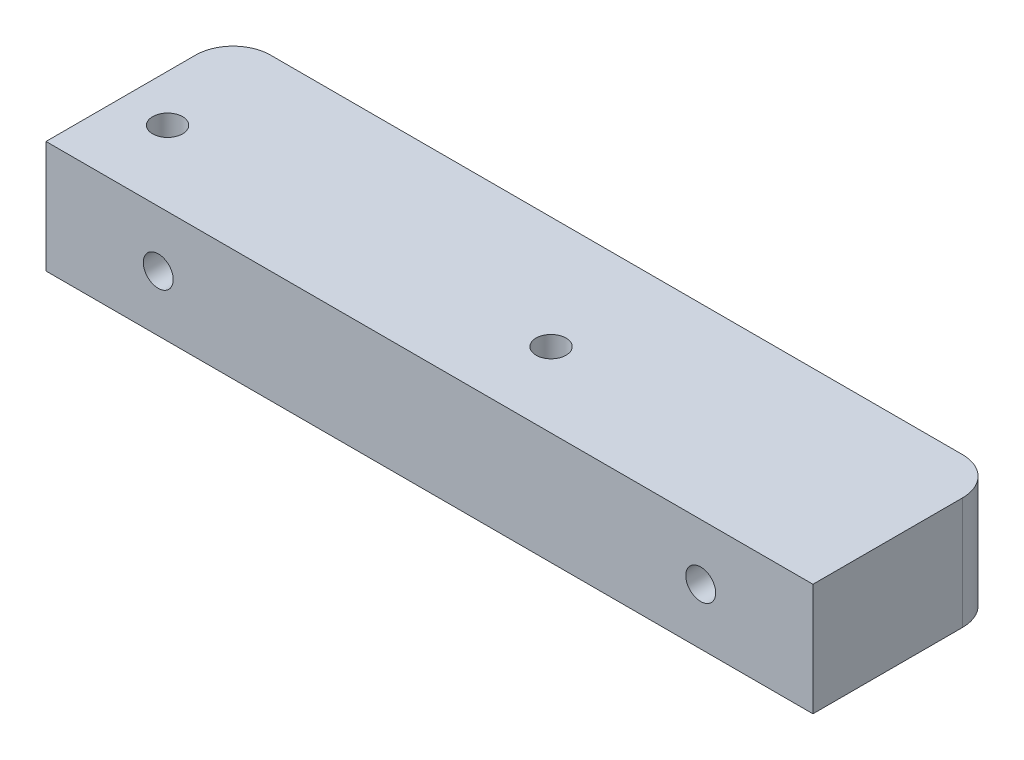
ISO-10303-21;
HEADER;
FILE_DESCRIPTION(('STEP AP214'),'2;1');
FILE_NAME('part.step','',(''),(''),'','','');
FILE_SCHEMA(('AUTOMOTIVE_DESIGN { 1 0 10303 214 1 1 1 1 }'));
ENDSEC;
DATA;
#1=APPLICATION_CONTEXT('core data for automotive mechanical design processes');
#2=APPLICATION_PROTOCOL_DEFINITION('international standard','automotive_design',2000,#1);
#3=PRODUCT_CONTEXT('',#1,'mechanical');
#4=PRODUCT('Part','Part','',(#3));
#5=PRODUCT_RELATED_PRODUCT_CATEGORY('part','',(#4));
#6=PRODUCT_DEFINITION_FORMATION('','',#4);
#7=PRODUCT_DEFINITION_CONTEXT('part definition',#1,'design');
#8=PRODUCT_DEFINITION('design','',#6,#7);
#9=PRODUCT_DEFINITION_SHAPE('','',#8);
#10=(LENGTH_UNIT() NAMED_UNIT(*) SI_UNIT(.MILLI.,.METRE.));
#11=(NAMED_UNIT(*) PLANE_ANGLE_UNIT() SI_UNIT($,.RADIAN.));
#12=(NAMED_UNIT(*) SI_UNIT($,.STERADIAN.) SOLID_ANGLE_UNIT());
#13=UNCERTAINTY_MEASURE_WITH_UNIT(LENGTH_MEASURE(1.E-05),#10,'distance_accuracy_value','');
#14=(GEOMETRIC_REPRESENTATION_CONTEXT(3) GLOBAL_UNCERTAINTY_ASSIGNED_CONTEXT((#13)) GLOBAL_UNIT_ASSIGNED_CONTEXT((#10,
#11,#12)) REPRESENTATION_CONTEXT('',''));
#15=CARTESIAN_POINT('',(0.,0.,0.));
#16=DIRECTION('',(0.,0.,1.));
#17=DIRECTION('',(1.,0.,0.));
#18=AXIS2_PLACEMENT_3D('',#15,#16,#17);
#19=CARTESIAN_POINT('',(0.,6.,0.));
#20=DIRECTION('',(-1.,0.,0.));
#21=DIRECTION('',(0.,0.,1.));
#22=AXIS2_PLACEMENT_3D('',#19,#20,#21);
#23=PLANE('',#22);
#24=DIRECTION('',(0.,0.,-1.));
#25=VECTOR('',#24,1.);
#26=CARTESIAN_POINT('',(0.,0.,0.));
#27=LINE('',#26,#25);
#28=CARTESIAN_POINT('',(0.,0.,0.));
#29=VERTEX_POINT('',#28);
#30=CARTESIAN_POINT('',(0.,0.,-8.00000000000001));
#31=VERTEX_POINT('',#30);
#32=EDGE_CURVE('E117',#29,#31,#27,.T.);
#33=ORIENTED_EDGE('',*,*,#32,.T.);
#34=DIRECTION('',(0.,-1.,0.));
#35=VECTOR('',#34,1.);
#36=CARTESIAN_POINT('',(0.,6.,-8.00000000000001));
#37=LINE('',#36,#35);
#38=CARTESIAN_POINT('',(0.,6.,-8.00000000000001));
#39=VERTEX_POINT('',#38);
#40=EDGE_CURVE('E11',#31,#39,#37,.F.);
#41=ORIENTED_EDGE('',*,*,#40,.T.);
#42=DIRECTION('',(0.,0.,-1.));
#43=VECTOR('',#42,1.);
#44=CARTESIAN_POINT('',(0.,6.,0.));
#45=LINE('',#44,#43);
#46=CARTESIAN_POINT('',(0.,6.,0.));
#47=VERTEX_POINT('',#46);
#48=EDGE_CURVE('E124',#47,#39,#45,.T.);
#49=ORIENTED_EDGE('',*,*,#48,.F.);
#50=DIRECTION('',(0.,-1.,0.));
#51=VECTOR('',#50,1.);
#52=CARTESIAN_POINT('',(0.,6.,0.));
#53=LINE('',#52,#51);
#54=EDGE_CURVE('E109',#47,#29,#53,.T.);
#55=ORIENTED_EDGE('',*,*,#54,.T.);
#56=EDGE_LOOP('',(#33,#41,#49,#55));
#57=FACE_BOUND('',#56,.T.);
#58=ADVANCED_FACE('F35',(#57),#23,.F.);
#59=CARTESIAN_POINT('',(0.,6.,-10.));
#60=DIRECTION('',(0.,0.,1.));
#61=DIRECTION('',(1.,0.,0.));
#62=AXIS2_PLACEMENT_3D('',#59,#60,#61);
#63=PLANE('',#62);
#64=DIRECTION('',(-1.,0.,0.));
#65=VECTOR('',#64,1.);
#66=CARTESIAN_POINT('',(0.,0.,-10.));
#67=LINE('',#66,#65);
#68=CARTESIAN_POINT('',(-2.,0.,-10.));
#69=VERTEX_POINT('',#68);
#70=CARTESIAN_POINT('',(-39.,0.,-10.));
#71=VERTEX_POINT('',#70);
#72=EDGE_CURVE('E119',#69,#71,#67,.T.);
#73=ORIENTED_EDGE('',*,*,#72,.T.);
#74=DIRECTION('',(0.,-1.,0.));
#75=VECTOR('',#74,1.);
#76=CARTESIAN_POINT('',(-39.,6.,-10.));
#77=LINE('',#76,#75);
#78=CARTESIAN_POINT('',(-39.,6.,-10.));
#79=VERTEX_POINT('',#78);
#80=EDGE_CURVE('E56',#71,#79,#77,.F.);
#81=ORIENTED_EDGE('',*,*,#80,.T.);
#82=DIRECTION('',(-1.,0.,0.));
#83=VECTOR('',#82,1.);
#84=CARTESIAN_POINT('',(0.,6.,-10.));
#85=LINE('',#84,#83);
#86=CARTESIAN_POINT('',(-2.,6.,-10.));
#87=VERTEX_POINT('',#86);
#88=EDGE_CURVE('E99',#87,#79,#85,.T.);
#89=ORIENTED_EDGE('',*,*,#88,.F.);
#90=DIRECTION('',(0.,-1.,0.));
#91=VECTOR('',#90,1.);
#92=CARTESIAN_POINT('',(-2.,6.,-10.));
#93=LINE('',#92,#91);
#94=EDGE_CURVE('E131',#87,#69,#93,.T.);
#95=ORIENTED_EDGE('',*,*,#94,.T.);
#96=EDGE_LOOP('',(#73,#81,#89,#95));
#97=FACE_BOUND('',#96,.T.);
#98=ADVANCED_FACE('F139',(#97),#63,.F.);
#99=CARTESIAN_POINT('',(-41.,6.,0.));
#100=DIRECTION('',(1.,0.,0.));
#101=DIRECTION('',(0.,0.,-1.));
#102=AXIS2_PLACEMENT_3D('',#99,#100,#101);
#103=PLANE('',#102);
#104=DIRECTION('',(0.,0.,1.));
#105=VECTOR('',#104,1.);
#106=CARTESIAN_POINT('',(-41.,6.,0.));
#107=LINE('',#106,#105);
#108=CARTESIAN_POINT('',(-41.,6.,-8.));
#109=VERTEX_POINT('',#108);
#110=CARTESIAN_POINT('',(-41.,6.,0.));
#111=VERTEX_POINT('',#110);
#112=EDGE_CURVE('E89',#109,#111,#107,.T.);
#113=ORIENTED_EDGE('',*,*,#112,.F.);
#114=DIRECTION('',(0.,-1.,0.));
#115=VECTOR('',#114,1.);
#116=CARTESIAN_POINT('',(-41.,6.,-8.));
#117=LINE('',#116,#115);
#118=CARTESIAN_POINT('',(-41.,0.,-8.));
#119=VERTEX_POINT('',#118);
#120=EDGE_CURVE('E108',#109,#119,#117,.T.);
#121=ORIENTED_EDGE('',*,*,#120,.T.);
#122=DIRECTION('',(0.,0.,1.));
#123=VECTOR('',#122,1.);
#124=CARTESIAN_POINT('',(-41.,0.,0.));
#125=LINE('',#124,#123);
#126=CARTESIAN_POINT('',(-41.,0.,0.));
#127=VERTEX_POINT('',#126);
#128=EDGE_CURVE('E105',#119,#127,#125,.T.);
#129=ORIENTED_EDGE('',*,*,#128,.T.);
#130=DIRECTION('',(0.,-1.,0.));
#131=VECTOR('',#130,1.);
#132=CARTESIAN_POINT('',(-41.,6.,0.));
#133=LINE('',#132,#131);
#134=EDGE_CURVE('E102',#111,#127,#133,.T.);
#135=ORIENTED_EDGE('',*,*,#134,.F.);
#136=EDGE_LOOP('',(#113,#121,#129,#135));
#137=FACE_BOUND('',#136,.T.);
#138=ADVANCED_FACE('F103',(#137),#103,.F.);
#139=CARTESIAN_POINT('',(0.,6.,0.));
#140=DIRECTION('',(0.,0.,-1.));
#141=DIRECTION('',(-1.,0.,0.));
#142=AXIS2_PLACEMENT_3D('',#139,#140,#141);
#143=PLANE('',#142);
#144=CARTESIAN_POINT('',(-6.,3.,0.));
#145=DIRECTION('',(0.,0.,1.));
#146=DIRECTION('',(1.,0.,0.));
#147=AXIS2_PLACEMENT_3D('',#144,#145,#146);
#148=CIRCLE('',#147,0.800000000000001);
#149=CARTESIAN_POINT('',(-5.2,3.,0.));
#150=VERTEX_POINT('',#149);
#151=EDGE_CURVE('E153',#150,#150,#148,.T.);
#152=ORIENTED_EDGE('',*,*,#151,.F.);
#153=EDGE_LOOP('',(#152));
#154=FACE_BOUND('',#153,.T.);
#155=CARTESIAN_POINT('',(-35.,3.,0.));
#156=DIRECTION('',(0.,0.,1.));
#157=DIRECTION('',(1.,0.,0.));
#158=AXIS2_PLACEMENT_3D('',#155,#156,#157);
#159=CIRCLE('',#158,0.800000000000003);
#160=CARTESIAN_POINT('',(-34.2,3.,0.));
#161=VERTEX_POINT('',#160);
#162=EDGE_CURVE('E146',#161,#161,#159,.T.);
#163=ORIENTED_EDGE('',*,*,#162,.F.);
#164=EDGE_LOOP('',(#163));
#165=FACE_BOUND('',#164,.T.);
#166=DIRECTION('',(1.,0.,0.));
#167=VECTOR('',#166,1.);
#168=CARTESIAN_POINT('',(0.,0.,0.));
#169=LINE('',#168,#167);
#170=EDGE_CURVE('E123',#127,#29,#169,.T.);
#171=ORIENTED_EDGE('',*,*,#170,.T.);
#172=ORIENTED_EDGE('',*,*,#54,.F.);
#173=DIRECTION('',(1.,0.,0.));
#174=VECTOR('',#173,1.);
#175=CARTESIAN_POINT('',(0.,6.,0.));
#176=LINE('',#175,#174);
#177=EDGE_CURVE('E93',#111,#47,#176,.T.);
#178=ORIENTED_EDGE('',*,*,#177,.F.);
#179=ORIENTED_EDGE('',*,*,#134,.T.);
#180=EDGE_LOOP('',(#171,#172,#178,#179));
#181=FACE_BOUND('',#180,.T.);
#182=ADVANCED_FACE('F111',(#154,#165,#181),#143,.F.);
#183=CARTESIAN_POINT('',(0.,6.,0.));
#184=DIRECTION('',(0.,1.,0.));
#185=DIRECTION('',(0.,0.,1.));
#186=AXIS2_PLACEMENT_3D('',#183,#184,#185);
#187=PLANE('',#186);
#188=CARTESIAN_POINT('',(-38.5,6.,-4.00000000000001));
#189=DIRECTION('',(0.,1.,0.));
#190=DIRECTION('',(0.,0.,1.));
#191=AXIS2_PLACEMENT_3D('',#188,#189,#190);
#192=CIRCLE('',#191,0.800000000000002);
#193=CARTESIAN_POINT('',(-38.5,6.,-3.20000000000001));
#194=VERTEX_POINT('',#193);
#195=EDGE_CURVE('E150',#194,#194,#192,.T.);
#196=ORIENTED_EDGE('',*,*,#195,.F.);
#197=EDGE_LOOP('',(#196));
#198=FACE_BOUND('',#197,.T.);
#199=CARTESIAN_POINT('',(-18.,6.,-4.00000000000001));
#200=DIRECTION('',(0.,1.,0.));
#201=DIRECTION('',(0.,0.,1.));
#202=AXIS2_PLACEMENT_3D('',#199,#200,#201);
#203=CIRCLE('',#202,0.799999999999999);
#204=CARTESIAN_POINT('',(-18.,6.,-3.20000000000001));
#205=VERTEX_POINT('',#204);
#206=EDGE_CURVE('E160',#205,#205,#203,.T.);
#207=ORIENTED_EDGE('',*,*,#206,.F.);
#208=EDGE_LOOP('',(#207));
#209=FACE_BOUND('',#208,.T.);
#210=ORIENTED_EDGE('',*,*,#88,.T.);
#211=CARTESIAN_POINT('',(-39.,6.,-8.));
#212=DIRECTION('',(0.,1.,0.));
#213=DIRECTION('',(0.,0.,1.));
#214=AXIS2_PLACEMENT_3D('',#211,#212,#213);
#215=CIRCLE('',#214,2.);
#216=EDGE_CURVE('E43',#79,#109,#215,.T.);
#217=ORIENTED_EDGE('',*,*,#216,.T.);
#218=ORIENTED_EDGE('',*,*,#112,.T.);
#219=ORIENTED_EDGE('',*,*,#177,.T.);
#220=ORIENTED_EDGE('',*,*,#48,.T.);
#221=CARTESIAN_POINT('',(-2.,6.,-8.00000000000001));
#222=DIRECTION('',(0.,1.,0.));
#223=DIRECTION('',(0.,0.,1.));
#224=AXIS2_PLACEMENT_3D('',#221,#222,#223);
#225=CIRCLE('',#224,2.);
#226=EDGE_CURVE('E135',#39,#87,#225,.T.);
#227=ORIENTED_EDGE('',*,*,#226,.T.);
#228=EDGE_LOOP('',(#210,#217,#218,#219,#220,#227));
#229=FACE_BOUND('',#228,.T.);
#230=ADVANCED_FACE('F91',(#198,#209,#229),#187,.T.);
#231=CARTESIAN_POINT('',(0.,0.,0.));
#232=DIRECTION('',(0.,1.,0.));
#233=DIRECTION('',(0.,0.,1.));
#234=AXIS2_PLACEMENT_3D('',#231,#232,#233);
#235=PLANE('',#234);
#236=CARTESIAN_POINT('',(-38.5,0.,-4.00000000000001));
#237=DIRECTION('',(0.,-1.,0.));
#238=DIRECTION('',(0.,0.,-1.));
#239=AXIS2_PLACEMENT_3D('',#236,#237,#238);
#240=CIRCLE('',#239,0.800000000000002);
#241=CARTESIAN_POINT('',(-38.5,0.,-4.80000000000001));
#242=VERTEX_POINT('',#241);
#243=EDGE_CURVE('E163',#242,#242,#240,.T.);
#244=ORIENTED_EDGE('',*,*,#243,.F.);
#245=EDGE_LOOP('',(#244));
#246=FACE_BOUND('',#245,.T.);
#247=CARTESIAN_POINT('',(-18.,0.,-4.00000000000001));
#248=DIRECTION('',(0.,-1.,0.));
#249=DIRECTION('',(0.,0.,-1.));
#250=AXIS2_PLACEMENT_3D('',#247,#248,#249);
#251=CIRCLE('',#250,0.799999999999999);
#252=CARTESIAN_POINT('',(-18.,0.,-4.80000000000001));
#253=VERTEX_POINT('',#252);
#254=EDGE_CURVE('E164',#253,#253,#251,.T.);
#255=ORIENTED_EDGE('',*,*,#254,.F.);
#256=EDGE_LOOP('',(#255));
#257=FACE_BOUND('',#256,.T.);
#258=ORIENTED_EDGE('',*,*,#128,.F.);
#259=CARTESIAN_POINT('',(-39.,0.,-8.));
#260=DIRECTION('',(0.,1.,0.));
#261=DIRECTION('',(0.,0.,1.));
#262=AXIS2_PLACEMENT_3D('',#259,#260,#261);
#263=CIRCLE('',#262,2.);
#264=EDGE_CURVE('E129',#119,#71,#263,.F.);
#265=ORIENTED_EDGE('',*,*,#264,.T.);
#266=ORIENTED_EDGE('',*,*,#72,.F.);
#267=CARTESIAN_POINT('',(-2.,0.,-8.00000000000001));
#268=DIRECTION('',(0.,1.,0.));
#269=DIRECTION('',(0.,0.,1.));
#270=AXIS2_PLACEMENT_3D('',#267,#268,#269);
#271=CIRCLE('',#270,2.);
#272=EDGE_CURVE('E127',#69,#31,#271,.F.);
#273=ORIENTED_EDGE('',*,*,#272,.T.);
#274=ORIENTED_EDGE('',*,*,#32,.F.);
#275=ORIENTED_EDGE('',*,*,#170,.F.);
#276=EDGE_LOOP('',(#258,#265,#266,#273,#274,#275));
#277=FACE_BOUND('',#276,.T.);
#278=ADVANCED_FACE('F143',(#246,#257,#277),#235,.F.);
#279=CARTESIAN_POINT('',(-35.,3.,-6.));
#280=DIRECTION('',(0.,0.,1.));
#281=DIRECTION('',(1.,0.,0.));
#282=AXIS2_PLACEMENT_3D('',#279,#280,#281);
#283=CYLINDRICAL_SURFACE('',#282,0.800000000000003);
#284=CARTESIAN_POINT('',(-35.,3.,-6.));
#285=DIRECTION('',(0.,0.,1.));
#286=DIRECTION('',(1.,0.,0.));
#287=AXIS2_PLACEMENT_3D('',#284,#285,#286);
#288=CIRCLE('',#287,0.800000000000003);
#289=CARTESIAN_POINT('',(-34.2,3.,-6.));
#290=VERTEX_POINT('',#289);
#291=EDGE_CURVE('E149',#290,#290,#288,.T.);
#292=ORIENTED_EDGE('',*,*,#291,.F.);
#293=EDGE_LOOP('',(#292));
#294=FACE_BOUND('',#293,.T.);
#295=ORIENTED_EDGE('',*,*,#162,.T.);
#296=EDGE_LOOP('',(#295));
#297=FACE_BOUND('',#296,.T.);
#298=ADVANCED_FACE('F174',(#294,#297),#283,.F.);
#299=CARTESIAN_POINT('',(-35.,3.,-6.));
#300=DIRECTION('',(0.,0.,1.));
#301=DIRECTION('',(1.,0.,0.));
#302=AXIS2_PLACEMENT_3D('',#299,#300,#301);
#303=PLANE('',#302);
#304=ORIENTED_EDGE('',*,*,#291,.T.);
#305=EDGE_LOOP('',(#304));
#306=FACE_BOUND('',#305,.T.);
#307=ADVANCED_FACE('F208',(#306),#303,.T.);
#308=CARTESIAN_POINT('',(-6.,3.,-6.));
#309=DIRECTION('',(0.,0.,1.));
#310=DIRECTION('',(1.,0.,0.));
#311=AXIS2_PLACEMENT_3D('',#308,#309,#310);
#312=CYLINDRICAL_SURFACE('',#311,0.800000000000001);
#313=CARTESIAN_POINT('',(-6.,3.,-6.));
#314=DIRECTION('',(0.,0.,1.));
#315=DIRECTION('',(1.,0.,0.));
#316=AXIS2_PLACEMENT_3D('',#313,#314,#315);
#317=CIRCLE('',#316,0.800000000000001);
#318=CARTESIAN_POINT('',(-5.2,3.,-6.));
#319=VERTEX_POINT('',#318);
#320=EDGE_CURVE('E120',#319,#319,#317,.T.);
#321=ORIENTED_EDGE('',*,*,#320,.F.);
#322=EDGE_LOOP('',(#321));
#323=FACE_BOUND('',#322,.T.);
#324=ORIENTED_EDGE('',*,*,#151,.T.);
#325=EDGE_LOOP('',(#324));
#326=FACE_BOUND('',#325,.T.);
#327=ADVANCED_FACE('F203',(#323,#326),#312,.F.);
#328=CARTESIAN_POINT('',(-6.,3.,-6.));
#329=DIRECTION('',(0.,0.,1.));
#330=DIRECTION('',(1.,0.,0.));
#331=AXIS2_PLACEMENT_3D('',#328,#329,#330);
#332=PLANE('',#331);
#333=ORIENTED_EDGE('',*,*,#320,.T.);
#334=EDGE_LOOP('',(#333));
#335=FACE_BOUND('',#334,.T.);
#336=ADVANCED_FACE('F198',(#335),#332,.T.);
#337=CARTESIAN_POINT('',(-39.,6.,-8.));
#338=DIRECTION('',(0.,-1.,0.));
#339=DIRECTION('',(0.,0.,-1.));
#340=AXIS2_PLACEMENT_3D('',#337,#338,#339);
#341=CYLINDRICAL_SURFACE('',#340,2.);
#342=ORIENTED_EDGE('',*,*,#216,.F.);
#343=ORIENTED_EDGE('',*,*,#80,.F.);
#344=ORIENTED_EDGE('',*,*,#264,.F.);
#345=ORIENTED_EDGE('',*,*,#120,.F.);
#346=EDGE_LOOP('',(#342,#343,#344,#345));
#347=FACE_BOUND('',#346,.T.);
#348=ADVANCED_FACE('F188',(#347),#341,.T.);
#349=CARTESIAN_POINT('',(-2.,6.,-8.00000000000001));
#350=DIRECTION('',(0.,-1.,0.));
#351=DIRECTION('',(0.,0.,-1.));
#352=AXIS2_PLACEMENT_3D('',#349,#350,#351);
#353=CYLINDRICAL_SURFACE('',#352,2.);
#354=ORIENTED_EDGE('',*,*,#226,.F.);
#355=ORIENTED_EDGE('',*,*,#40,.F.);
#356=ORIENTED_EDGE('',*,*,#272,.F.);
#357=ORIENTED_EDGE('',*,*,#94,.F.);
#358=EDGE_LOOP('',(#354,#355,#356,#357));
#359=FACE_BOUND('',#358,.T.);
#360=ADVANCED_FACE('F37',(#359),#353,.T.);
#361=CARTESIAN_POINT('',(-18.,10.,-4.00000000000001));
#362=DIRECTION('',(0.,-1.,0.));
#363=DIRECTION('',(0.,0.,-1.));
#364=AXIS2_PLACEMENT_3D('',#361,#362,#363);
#365=CYLINDRICAL_SURFACE('',#364,0.799999999999999);
#366=ORIENTED_EDGE('',*,*,#206,.T.);
#367=EDGE_LOOP('',(#366));
#368=FACE_BOUND('',#367,.T.);
#369=ORIENTED_EDGE('',*,*,#254,.T.);
#370=EDGE_LOOP('',(#369));
#371=FACE_BOUND('',#370,.T.);
#372=ADVANCED_FACE('F178',(#368,#371),#365,.F.);
#373=CARTESIAN_POINT('',(-38.5,10.,-4.00000000000001));
#374=DIRECTION('',(0.,-1.,0.));
#375=DIRECTION('',(0.,0.,-1.));
#376=AXIS2_PLACEMENT_3D('',#373,#374,#375);
#377=CYLINDRICAL_SURFACE('',#376,0.800000000000002);
#378=ORIENTED_EDGE('',*,*,#195,.T.);
#379=EDGE_LOOP('',(#378));
#380=FACE_BOUND('',#379,.T.);
#381=ORIENTED_EDGE('',*,*,#243,.T.);
#382=EDGE_LOOP('',(#381));
#383=FACE_BOUND('',#382,.T.);
#384=ADVANCED_FACE('F170',(#380,#383),#377,.F.);
#385=CLOSED_SHELL('',(#58,#98,#138,#182,#230,#278,#298,#307,#327,#336,#348,#360,#372,#384));
#386=MANIFOLD_SOLID_BREP('B2',#385);
#387=ADVANCED_BREP_SHAPE_REPRESENTATION('',(#18,#386),#14);
#388=SHAPE_DEFINITION_REPRESENTATION(#9,#387);
ENDSEC;
END-ISO-10303-21;
